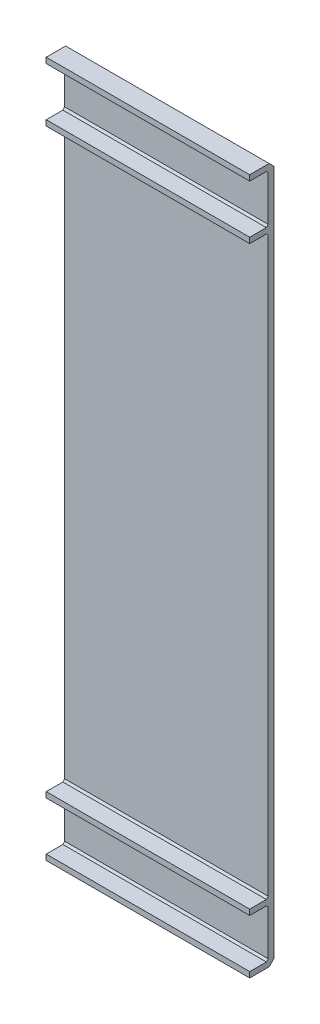
ISO-10303-21;
HEADER;
FILE_DESCRIPTION(('STEP AP214'),'2;1');
FILE_NAME('part.step','',(''),(''),'','','');
FILE_SCHEMA(('AUTOMOTIVE_DESIGN { 1 0 10303 214 1 1 1 1 }'));
ENDSEC;
DATA;
#1=APPLICATION_CONTEXT('core data for automotive mechanical design processes');
#2=APPLICATION_PROTOCOL_DEFINITION('international standard','automotive_design',2000,#1);
#3=PRODUCT_CONTEXT('',#1,'mechanical');
#4=PRODUCT('Part','Part','',(#3));
#5=PRODUCT_RELATED_PRODUCT_CATEGORY('part','',(#4));
#6=PRODUCT_DEFINITION_FORMATION('','',#4);
#7=PRODUCT_DEFINITION_CONTEXT('part definition',#1,'design');
#8=PRODUCT_DEFINITION('design','',#6,#7);
#9=PRODUCT_DEFINITION_SHAPE('','',#8);
#10=(LENGTH_UNIT() NAMED_UNIT(*) SI_UNIT(.MILLI.,.METRE.));
#11=(NAMED_UNIT(*) PLANE_ANGLE_UNIT() SI_UNIT($,.RADIAN.));
#12=(NAMED_UNIT(*) SI_UNIT($,.STERADIAN.) SOLID_ANGLE_UNIT());
#13=UNCERTAINTY_MEASURE_WITH_UNIT(LENGTH_MEASURE(1.E-05),#10,'distance_accuracy_value','');
#14=(GEOMETRIC_REPRESENTATION_CONTEXT(3) GLOBAL_UNCERTAINTY_ASSIGNED_CONTEXT((#13)) GLOBAL_UNIT_ASSIGNED_CONTEXT((#10,
#11,#12)) REPRESENTATION_CONTEXT('',''));
#15=CARTESIAN_POINT('',(0.,0.,0.));
#16=DIRECTION('',(0.,0.,1.));
#17=DIRECTION('',(1.,0.,0.));
#18=AXIS2_PLACEMENT_3D('',#15,#16,#17);
#19=CARTESIAN_POINT('',(0.,0.,1.2));
#20=DIRECTION('',(0.,0.,1.));
#21=DIRECTION('',(1.,0.,0.));
#22=AXIS2_PLACEMENT_3D('',#19,#20,#21);
#23=PLANE('',#22);
#24=DIRECTION('',(0.,1.,0.));
#25=VECTOR('',#24,1.);
#26=CARTESIAN_POINT('',(22.,-75.2,1.2));
#27=LINE('',#26,#25);
#28=CARTESIAN_POINT('',(22.,-61.9,1.2));
#29=VERTEX_POINT('',#28);
#30=CARTESIAN_POINT('',(22.,61.9,1.2));
#31=VERTEX_POINT('',#30);
#32=EDGE_CURVE('E341',#29,#31,#27,.T.);
#33=ORIENTED_EDGE('',*,*,#32,.T.);
#34=DIRECTION('',(-1.,0.,0.));
#35=VECTOR('',#34,1.);
#36=CARTESIAN_POINT('',(0.,61.9,1.2));
#37=LINE('',#36,#35);
#38=CARTESIAN_POINT('',(-22.,61.9,1.2));
#39=VERTEX_POINT('',#38);
#40=EDGE_CURVE('E376',#31,#39,#37,.T.);
#41=ORIENTED_EDGE('',*,*,#40,.T.);
#42=DIRECTION('',(0.,-1.,0.));
#43=VECTOR('',#42,1.);
#44=CARTESIAN_POINT('',(-22.,-75.2,1.2));
#45=LINE('',#44,#43);
#46=CARTESIAN_POINT('',(-22.,-61.9,1.2));
#47=VERTEX_POINT('',#46);
#48=EDGE_CURVE('E335',#39,#47,#45,.T.);
#49=ORIENTED_EDGE('',*,*,#48,.T.);
#50=DIRECTION('',(1.,0.,0.));
#51=VECTOR('',#50,1.);
#52=CARTESIAN_POINT('',(0.,-61.9,1.2));
#53=LINE('',#52,#51);
#54=EDGE_CURVE('E373',#47,#29,#53,.T.);
#55=ORIENTED_EDGE('',*,*,#54,.T.);
#56=EDGE_LOOP('',(#33,#41,#49,#55));
#57=FACE_BOUND('',#56,.T.);
#58=ADVANCED_FACE('F46',(#57),#23,.T.);
#59=CARTESIAN_POINT('',(22.,63.9,1.2));
#60=VERTEX_POINT('',#59);
#61=CARTESIAN_POINT('',(22.,73.6000000000001,1.2));
#62=VERTEX_POINT('',#61);
#63=EDGE_CURVE('E342',#60,#62,#27,.T.);
#64=ORIENTED_EDGE('',*,*,#63,.T.);
#65=DIRECTION('',(-1.,0.,0.));
#66=VECTOR('',#65,1.);
#67=CARTESIAN_POINT('',(0.,73.6,1.2));
#68=LINE('',#67,#66);
#69=CARTESIAN_POINT('',(-22.,73.6000000000001,1.2));
#70=VERTEX_POINT('',#69);
#71=EDGE_CURVE('E366',#62,#70,#68,.T.);
#72=ORIENTED_EDGE('',*,*,#71,.T.);
#73=CARTESIAN_POINT('',(-22.,63.9,1.2));
#74=VERTEX_POINT('',#73);
#75=EDGE_CURVE('E336',#70,#74,#45,.T.);
#76=ORIENTED_EDGE('',*,*,#75,.T.);
#77=DIRECTION('',(1.,0.,0.));
#78=VECTOR('',#77,1.);
#79=CARTESIAN_POINT('',(0.,63.9,1.2));
#80=LINE('',#79,#78);
#81=EDGE_CURVE('E363',#74,#60,#80,.T.);
#82=ORIENTED_EDGE('',*,*,#81,.T.);
#83=EDGE_LOOP('',(#64,#72,#76,#82));
#84=FACE_BOUND('',#83,.T.);
#85=ADVANCED_FACE('F544',(#84),#23,.T.);
#86=CARTESIAN_POINT('',(-22.,75.2,1.2));
#87=DIRECTION('',(0.,-1.,0.));
#88=DIRECTION('',(0.,0.,-1.));
#89=AXIS2_PLACEMENT_3D('',#86,#87,#88);
#90=PLANE('',#89);
#91=DIRECTION('',(0.,0.,-1.));
#92=VECTOR('',#91,1.);
#93=CARTESIAN_POINT('',(22.,75.2,1.2));
#94=LINE('',#93,#92);
#95=CARTESIAN_POINT('',(22.,75.2,5.2));
#96=VERTEX_POINT('',#95);
#97=CARTESIAN_POINT('',(22.,75.2,0.999999999999987));
#98=VERTEX_POINT('',#97);
#99=EDGE_CURVE('E340',#96,#98,#94,.T.);
#100=ORIENTED_EDGE('',*,*,#99,.T.);
#101=DIRECTION('',(-1.,0.,0.));
#102=VECTOR('',#101,1.);
#103=CARTESIAN_POINT('',(-22.,75.2,0.999999999999987));
#104=LINE('',#103,#102);
#105=CARTESIAN_POINT('',(-22.,75.2,0.999999999999987));
#106=VERTEX_POINT('',#105);
#107=EDGE_CURVE('E436',#98,#106,#104,.T.);
#108=ORIENTED_EDGE('',*,*,#107,.T.);
#109=DIRECTION('',(0.,0.,-1.));
#110=VECTOR('',#109,1.);
#111=CARTESIAN_POINT('',(-22.,75.2,1.2));
#112=LINE('',#111,#110);
#113=CARTESIAN_POINT('',(-22.,75.2,5.2));
#114=VERTEX_POINT('',#113);
#115=EDGE_CURVE('E357',#114,#106,#112,.T.);
#116=ORIENTED_EDGE('',*,*,#115,.F.);
#117=DIRECTION('',(-1.,0.,0.));
#118=VECTOR('',#117,1.);
#119=CARTESIAN_POINT('',(-22.,75.2,5.2));
#120=LINE('',#119,#118);
#121=EDGE_CURVE('E231',#96,#114,#120,.T.);
#122=ORIENTED_EDGE('',*,*,#121,.F.);
#123=EDGE_LOOP('',(#100,#108,#116,#122));
#124=FACE_BOUND('',#123,.T.);
#125=ADVANCED_FACE('F459',(#124),#90,.F.);
#126=CARTESIAN_POINT('',(-22.,-75.2,1.2));
#127=DIRECTION('',(1.,0.,0.));
#128=DIRECTION('',(0.,0.,-1.));
#129=AXIS2_PLACEMENT_3D('',#126,#127,#128);
#130=PLANE('',#129);
#131=ORIENTED_EDGE('',*,*,#115,.T.);
#132=DIRECTION('',(0.,0.707106781186552,0.707106781186543));
#133=VECTOR('',#132,1.);
#134=CARTESIAN_POINT('',(-22.,75.2,0.999999999999987));
#135=LINE('',#134,#133);
#136=CARTESIAN_POINT('',(-22.,74.2,0.));
#137=VERTEX_POINT('',#136);
#138=EDGE_CURVE('E443',#106,#137,#135,.F.);
#139=ORIENTED_EDGE('',*,*,#138,.T.);
#140=DIRECTION('',(0.,-1.,0.));
#141=VECTOR('',#140,1.);
#142=CARTESIAN_POINT('',(-22.,-75.2,0.));
#143=LINE('',#142,#141);
#144=CARTESIAN_POINT('',(-22.,-74.2,0.));
#145=VERTEX_POINT('',#144);
#146=EDGE_CURVE('E242',#137,#145,#143,.T.);
#147=ORIENTED_EDGE('',*,*,#146,.T.);
#148=DIRECTION('',(0.,0.707106781186552,-0.707106781186543));
#149=VECTOR('',#148,1.);
#150=CARTESIAN_POINT('',(-22.,-75.2,0.999999999999987));
#151=LINE('',#150,#149);
#152=CARTESIAN_POINT('',(-22.,-75.2,0.999999999999987));
#153=VERTEX_POINT('',#152);
#154=EDGE_CURVE('E440',#145,#153,#151,.F.);
#155=ORIENTED_EDGE('',*,*,#154,.T.);
#156=DIRECTION('',(0.,0.,-1.));
#157=VECTOR('',#156,1.);
#158=CARTESIAN_POINT('',(-22.,-75.2,1.2));
#159=LINE('',#158,#157);
#160=CARTESIAN_POINT('',(-22.,-75.2,5.2));
#161=VERTEX_POINT('',#160);
#162=EDGE_CURVE('E353',#161,#153,#159,.T.);
#163=ORIENTED_EDGE('',*,*,#162,.F.);
#164=DIRECTION('',(0.,-1.,0.));
#165=VECTOR('',#164,1.);
#166=CARTESIAN_POINT('',(-22.,-75.2,5.2));
#167=LINE('',#166,#165);
#168=CARTESIAN_POINT('',(-22.,-74.,5.2));
#169=VERTEX_POINT('',#168);
#170=EDGE_CURVE('E235',#169,#161,#167,.T.);
#171=ORIENTED_EDGE('',*,*,#170,.F.);
#172=DIRECTION('',(0.,0.,-1.));
#173=VECTOR('',#172,1.);
#174=CARTESIAN_POINT('',(-22.,-74.,5.2));
#175=LINE('',#174,#173);
#176=CARTESIAN_POINT('',(-22.,-74.,1.59999999999997));
#177=VERTEX_POINT('',#176);
#178=EDGE_CURVE('E256',#169,#177,#175,.T.);
#179=ORIENTED_EDGE('',*,*,#178,.T.);
#180=DIRECTION('',(0.,0.707106781186548,-0.707106781186547));
#181=VECTOR('',#180,1.);
#182=CARTESIAN_POINT('',(-22.,-74.4,1.99999999999999));
#183=LINE('',#182,#181);
#184=CARTESIAN_POINT('',(-22.,-73.6,1.2));
#185=VERTEX_POINT('',#184);
#186=EDGE_CURVE('E424',#177,#185,#183,.T.);
#187=ORIENTED_EDGE('',*,*,#186,.T.);
#188=CARTESIAN_POINT('',(-22.,-63.9,1.2));
#189=VERTEX_POINT('',#188);
#190=EDGE_CURVE('E331',#189,#185,#45,.T.);
#191=ORIENTED_EDGE('',*,*,#190,.F.);
#192=DIRECTION('',(0.,0.707106781186548,0.707106781186547));
#193=VECTOR('',#192,1.);
#194=CARTESIAN_POINT('',(-22.,-69.55,-4.45000000000002));
#195=LINE('',#194,#193);
#196=CARTESIAN_POINT('',(-22.,-63.5,1.59999999999997));
#197=VERTEX_POINT('',#196);
#198=EDGE_CURVE('E433',#189,#197,#195,.T.);
#199=ORIENTED_EDGE('',*,*,#198,.T.);
#200=DIRECTION('',(0.,0.,-1.));
#201=VECTOR('',#200,1.);
#202=CARTESIAN_POINT('',(-22.,-63.5,5.2));
#203=LINE('',#202,#201);
#204=CARTESIAN_POINT('',(-22.,-63.5,5.2));
#205=VERTEX_POINT('',#204);
#206=EDGE_CURVE('E274',#205,#197,#203,.T.);
#207=ORIENTED_EDGE('',*,*,#206,.F.);
#208=DIRECTION('',(0.,-1.,0.));
#209=VECTOR('',#208,1.);
#210=CARTESIAN_POINT('',(-22.,-62.3,5.2));
#211=LINE('',#210,#209);
#212=CARTESIAN_POINT('',(-22.,-62.3,5.2));
#213=VERTEX_POINT('',#212);
#214=EDGE_CURVE('E257',#213,#205,#211,.T.);
#215=ORIENTED_EDGE('',*,*,#214,.F.);
#216=DIRECTION('',(0.,0.,-1.));
#217=VECTOR('',#216,1.);
#218=CARTESIAN_POINT('',(-22.,-62.3,5.2));
#219=LINE('',#218,#217);
#220=CARTESIAN_POINT('',(-22.,-62.3,1.6));
#221=VERTEX_POINT('',#220);
#222=EDGE_CURVE('E287',#213,#221,#219,.T.);
#223=ORIENTED_EDGE('',*,*,#222,.T.);
#224=DIRECTION('',(0.,0.707106781186535,-0.70710678118656));
#225=VECTOR('',#224,1.);
#226=CARTESIAN_POINT('',(-22.,-68.5499999999998,7.84999999999999));
#227=LINE('',#226,#225);
#228=EDGE_CURVE('E418',#221,#47,#227,.T.);
#229=ORIENTED_EDGE('',*,*,#228,.T.);
#230=ORIENTED_EDGE('',*,*,#48,.F.);
#231=DIRECTION('',(0.,0.707106781186548,0.707106781186547));
#232=VECTOR('',#231,1.);
#233=CARTESIAN_POINT('',(-22.,-6.65,-67.35));
#234=LINE('',#233,#232);
#235=CARTESIAN_POINT('',(-22.,62.3,1.59999999999997));
#236=VERTEX_POINT('',#235);
#237=EDGE_CURVE('E409',#39,#236,#234,.T.);
#238=ORIENTED_EDGE('',*,*,#237,.T.);
#239=DIRECTION('',(0.,0.,-1.));
#240=VECTOR('',#239,1.);
#241=CARTESIAN_POINT('',(-22.,62.3,5.2));
#242=LINE('',#241,#240);
#243=CARTESIAN_POINT('',(-22.,62.3,5.2));
#244=VERTEX_POINT('',#243);
#245=EDGE_CURVE('E303',#244,#236,#242,.T.);
#246=ORIENTED_EDGE('',*,*,#245,.F.);
#247=DIRECTION('',(0.,-1.,0.));
#248=VECTOR('',#247,1.);
#249=CARTESIAN_POINT('',(-22.,63.5,5.2));
#250=LINE('',#249,#248);
#251=CARTESIAN_POINT('',(-22.,63.5,5.2));
#252=VERTEX_POINT('',#251);
#253=EDGE_CURVE('E279',#252,#244,#250,.T.);
#254=ORIENTED_EDGE('',*,*,#253,.F.);
#255=DIRECTION('',(0.,0.,-1.));
#256=VECTOR('',#255,1.);
#257=CARTESIAN_POINT('',(-22.,63.5,5.2));
#258=LINE('',#257,#256);
#259=CARTESIAN_POINT('',(-22.,63.5,1.59999999999997));
#260=VERTEX_POINT('',#259);
#261=EDGE_CURVE('E315',#252,#260,#258,.T.);
#262=ORIENTED_EDGE('',*,*,#261,.T.);
#263=DIRECTION('',(0.,0.707106781186548,-0.707106781186547));
#264=VECTOR('',#263,1.);
#265=CARTESIAN_POINT('',(-22.,-5.65000000000004,70.75));
#266=LINE('',#265,#264);
#267=EDGE_CURVE('E412',#260,#74,#266,.T.);
#268=ORIENTED_EDGE('',*,*,#267,.T.);
#269=ORIENTED_EDGE('',*,*,#75,.F.);
#270=DIRECTION('',(0.,0.707106781186548,0.707106781186547));
#271=VECTOR('',#270,1.);
#272=CARTESIAN_POINT('',(-22.,-0.800000000000009,-73.2));
#273=LINE('',#272,#271);
#274=CARTESIAN_POINT('',(-22.,74.,1.59999999999997));
#275=VERTEX_POINT('',#274);
#276=EDGE_CURVE('E240',#70,#275,#273,.T.);
#277=ORIENTED_EDGE('',*,*,#276,.T.);
#278=DIRECTION('',(0.,0.,-1.));
#279=VECTOR('',#278,1.);
#280=CARTESIAN_POINT('',(-22.,74.,5.2));
#281=LINE('',#280,#279);
#282=CARTESIAN_POINT('',(-22.,74.,5.2));
#283=VERTEX_POINT('',#282);
#284=EDGE_CURVE('E216',#283,#275,#281,.T.);
#285=ORIENTED_EDGE('',*,*,#284,.F.);
#286=DIRECTION('',(0.,-1.,0.));
#287=VECTOR('',#286,1.);
#288=CARTESIAN_POINT('',(-22.,75.2,5.2));
#289=LINE('',#288,#287);
#290=EDGE_CURVE('E225',#114,#283,#289,.T.);
#291=ORIENTED_EDGE('',*,*,#290,.F.);
#292=EDGE_LOOP('',(#131,#139,#147,#155,#163,#171,#179,#187,#191,#199,#207,#215,#223,#229,#230,
#238,#246,#254,#262,#268,#269,#277,#285,#291));
#293=FACE_BOUND('',#292,.T.);
#294=ADVANCED_FACE('F237',(#293),#130,.F.);
#295=CARTESIAN_POINT('',(-22.,-75.2,1.2));
#296=DIRECTION('',(0.,1.,0.));
#297=DIRECTION('',(0.,0.,1.));
#298=AXIS2_PLACEMENT_3D('',#295,#296,#297);
#299=PLANE('',#298);
#300=ORIENTED_EDGE('',*,*,#162,.T.);
#301=DIRECTION('',(1.,0.,0.));
#302=VECTOR('',#301,1.);
#303=CARTESIAN_POINT('',(-22.,-75.2,0.999999999999987));
#304=LINE('',#303,#302);
#305=CARTESIAN_POINT('',(22.,-75.2,0.999999999999987));
#306=VERTEX_POINT('',#305);
#307=EDGE_CURVE('E11',#153,#306,#304,.T.);
#308=ORIENTED_EDGE('',*,*,#307,.T.);
#309=DIRECTION('',(0.,0.,-1.));
#310=VECTOR('',#309,1.);
#311=CARTESIAN_POINT('',(22.,-75.2,1.2));
#312=LINE('',#311,#310);
#313=CARTESIAN_POINT('',(22.,-75.2,5.2));
#314=VERTEX_POINT('',#313);
#315=EDGE_CURVE('E349',#314,#306,#312,.T.);
#316=ORIENTED_EDGE('',*,*,#315,.F.);
#317=DIRECTION('',(1.,0.,0.));
#318=VECTOR('',#317,1.);
#319=CARTESIAN_POINT('',(-22.,-75.2,5.2));
#320=LINE('',#319,#318);
#321=EDGE_CURVE('E267',#161,#314,#320,.T.);
#322=ORIENTED_EDGE('',*,*,#321,.F.);
#323=EDGE_LOOP('',(#300,#308,#316,#322));
#324=FACE_BOUND('',#323,.T.);
#325=ADVANCED_FACE('F466',(#324),#299,.F.);
#326=CARTESIAN_POINT('',(22.,-75.2,1.2));
#327=DIRECTION('',(-1.,0.,0.));
#328=DIRECTION('',(0.,0.,1.));
#329=AXIS2_PLACEMENT_3D('',#326,#327,#328);
#330=PLANE('',#329);
#331=DIRECTION('',(0.,1.,0.));
#332=VECTOR('',#331,1.);
#333=CARTESIAN_POINT('',(22.,-75.2,0.));
#334=LINE('',#333,#332);
#335=CARTESIAN_POINT('',(22.,-74.2,0.));
#336=VERTEX_POINT('',#335);
#337=CARTESIAN_POINT('',(22.,74.2,0.));
#338=VERTEX_POINT('',#337);
#339=EDGE_CURVE('E247',#336,#338,#334,.T.);
#340=ORIENTED_EDGE('',*,*,#339,.T.);
#341=DIRECTION('',(0.,-0.707106781186552,-0.707106781186543));
#342=VECTOR('',#341,1.);
#343=CARTESIAN_POINT('',(22.,75.2,0.999999999999987));
#344=LINE('',#343,#342);
#345=EDGE_CURVE('E56',#338,#98,#344,.F.);
#346=ORIENTED_EDGE('',*,*,#345,.T.);
#347=ORIENTED_EDGE('',*,*,#99,.F.);
#348=DIRECTION('',(0.,1.,0.));
#349=VECTOR('',#348,1.);
#350=CARTESIAN_POINT('',(22.,75.2,5.2));
#351=LINE('',#350,#349);
#352=CARTESIAN_POINT('',(22.,74.,5.2));
#353=VERTEX_POINT('',#352);
#354=EDGE_CURVE('E224',#353,#96,#351,.T.);
#355=ORIENTED_EDGE('',*,*,#354,.F.);
#356=DIRECTION('',(0.,0.,-1.));
#357=VECTOR('',#356,1.);
#358=CARTESIAN_POINT('',(22.,74.,5.2));
#359=LINE('',#358,#357);
#360=CARTESIAN_POINT('',(22.,74.,1.59999999999997));
#361=VERTEX_POINT('',#360);
#362=EDGE_CURVE('E219',#353,#361,#359,.T.);
#363=ORIENTED_EDGE('',*,*,#362,.T.);
#364=DIRECTION('',(0.,-0.707106781186548,-0.707106781186547));
#365=VECTOR('',#364,1.);
#366=CARTESIAN_POINT('',(22.,-0.800000000000009,-73.2));
#367=LINE('',#366,#365);
#368=EDGE_CURVE('E401',#361,#62,#367,.T.);
#369=ORIENTED_EDGE('',*,*,#368,.T.);
#370=ORIENTED_EDGE('',*,*,#63,.F.);
#371=DIRECTION('',(0.,-0.707106781186548,0.707106781186547));
#372=VECTOR('',#371,1.);
#373=CARTESIAN_POINT('',(22.,-5.65000000000004,70.75));
#374=LINE('',#373,#372);
#375=CARTESIAN_POINT('',(22.,63.5,1.59999999999997));
#376=VERTEX_POINT('',#375);
#377=EDGE_CURVE('E415',#60,#376,#374,.T.);
#378=ORIENTED_EDGE('',*,*,#377,.T.);
#379=DIRECTION('',(0.,0.,-1.));
#380=VECTOR('',#379,1.);
#381=CARTESIAN_POINT('',(22.,63.5,5.2));
#382=LINE('',#381,#380);
#383=CARTESIAN_POINT('',(22.,63.5,5.2));
#384=VERTEX_POINT('',#383);
#385=EDGE_CURVE('E311',#384,#376,#382,.T.);
#386=ORIENTED_EDGE('',*,*,#385,.F.);
#387=DIRECTION('',(0.,1.,0.));
#388=VECTOR('',#387,1.);
#389=CARTESIAN_POINT('',(22.,63.5,5.2));
#390=LINE('',#389,#388);
#391=CARTESIAN_POINT('',(22.,62.3,5.2));
#392=VERTEX_POINT('',#391);
#393=EDGE_CURVE('E322',#392,#384,#390,.T.);
#394=ORIENTED_EDGE('',*,*,#393,.F.);
#395=DIRECTION('',(0.,0.,-1.));
#396=VECTOR('',#395,1.);
#397=CARTESIAN_POINT('',(22.,62.3,5.2));
#398=LINE('',#397,#396);
#399=CARTESIAN_POINT('',(22.,62.3,1.59999999999997));
#400=VERTEX_POINT('',#399);
#401=EDGE_CURVE('E307',#392,#400,#398,.T.);
#402=ORIENTED_EDGE('',*,*,#401,.T.);
#403=DIRECTION('',(0.,-0.707106781186548,-0.707106781186547));
#404=VECTOR('',#403,1.);
#405=CARTESIAN_POINT('',(22.,-6.65,-67.35));
#406=LINE('',#405,#404);
#407=EDGE_CURVE('E406',#400,#31,#406,.T.);
#408=ORIENTED_EDGE('',*,*,#407,.T.);
#409=ORIENTED_EDGE('',*,*,#32,.F.);
#410=DIRECTION('',(0.,-0.707106781186535,0.70710678118656));
#411=VECTOR('',#410,1.);
#412=CARTESIAN_POINT('',(22.,-68.5499999999998,7.85));
#413=LINE('',#412,#411);
#414=CARTESIAN_POINT('',(22.,-62.3,1.6));
#415=VERTEX_POINT('',#414);
#416=EDGE_CURVE('E421',#29,#415,#413,.T.);
#417=ORIENTED_EDGE('',*,*,#416,.T.);
#418=DIRECTION('',(0.,0.,-1.));
#419=VECTOR('',#418,1.);
#420=CARTESIAN_POINT('',(22.,-62.3,5.2));
#421=LINE('',#420,#419);
#422=CARTESIAN_POINT('',(22.,-62.3,5.2));
#423=VERTEX_POINT('',#422);
#424=EDGE_CURVE('E283',#423,#415,#421,.T.);
#425=ORIENTED_EDGE('',*,*,#424,.F.);
#426=DIRECTION('',(0.,1.,0.));
#427=VECTOR('',#426,1.);
#428=CARTESIAN_POINT('',(22.,-62.3,5.2));
#429=LINE('',#428,#427);
#430=CARTESIAN_POINT('',(22.,-63.5,5.2));
#431=VERTEX_POINT('',#430);
#432=EDGE_CURVE('E294',#431,#423,#429,.T.);
#433=ORIENTED_EDGE('',*,*,#432,.F.);
#434=DIRECTION('',(0.,0.,-1.));
#435=VECTOR('',#434,1.);
#436=CARTESIAN_POINT('',(22.,-63.5,5.2));
#437=LINE('',#436,#435);
#438=CARTESIAN_POINT('',(22.,-63.5,1.59999999999997));
#439=VERTEX_POINT('',#438);
#440=EDGE_CURVE('E278',#431,#439,#437,.T.);
#441=ORIENTED_EDGE('',*,*,#440,.T.);
#442=DIRECTION('',(0.,-0.707106781186548,-0.707106781186547));
#443=VECTOR('',#442,1.);
#444=CARTESIAN_POINT('',(22.,-69.55,-4.45000000000002));
#445=LINE('',#444,#443);
#446=CARTESIAN_POINT('',(22.,-63.9,1.2));
#447=VERTEX_POINT('',#446);
#448=EDGE_CURVE('E430',#439,#447,#445,.T.);
#449=ORIENTED_EDGE('',*,*,#448,.T.);
#450=CARTESIAN_POINT('',(22.,-73.6,1.2));
#451=VERTEX_POINT('',#450);
#452=EDGE_CURVE('E337',#451,#447,#27,.T.);
#453=ORIENTED_EDGE('',*,*,#452,.F.);
#454=DIRECTION('',(0.,-0.707106781186548,0.707106781186547));
#455=VECTOR('',#454,1.);
#456=CARTESIAN_POINT('',(22.,-74.4,1.99999999999999));
#457=LINE('',#456,#455);
#458=CARTESIAN_POINT('',(22.,-74.,1.59999999999997));
#459=VERTEX_POINT('',#458);
#460=EDGE_CURVE('E427',#451,#459,#457,.T.);
#461=ORIENTED_EDGE('',*,*,#460,.T.);
#462=DIRECTION('',(0.,0.,-1.));
#463=VECTOR('',#462,1.);
#464=CARTESIAN_POINT('',(22.,-74.,5.2));
#465=LINE('',#464,#463);
#466=CARTESIAN_POINT('',(22.,-74.,5.2));
#467=VERTEX_POINT('',#466);
#468=EDGE_CURVE('E252',#467,#459,#465,.T.);
#469=ORIENTED_EDGE('',*,*,#468,.F.);
#470=DIRECTION('',(0.,1.,0.));
#471=VECTOR('',#470,1.);
#472=CARTESIAN_POINT('',(22.,-75.2,5.2));
#473=LINE('',#472,#471);
#474=EDGE_CURVE('E264',#314,#467,#473,.T.);
#475=ORIENTED_EDGE('',*,*,#474,.F.);
#476=ORIENTED_EDGE('',*,*,#315,.T.);
#477=DIRECTION('',(0.,-0.707106781186552,0.707106781186543));
#478=VECTOR('',#477,1.);
#479=CARTESIAN_POINT('',(22.,-75.2,0.999999999999987));
#480=LINE('',#479,#478);
#481=EDGE_CURVE('E63',#306,#336,#480,.F.);
#482=ORIENTED_EDGE('',*,*,#481,.T.);
#483=EDGE_LOOP('',(#340,#346,#347,#355,#363,#369,#370,#378,#386,#394,#402,#408,#409,#417,#425,
#433,#441,#449,#453,#461,#469,#475,#476,#482));
#484=FACE_BOUND('',#483,.T.);
#485=ADVANCED_FACE('F455',(#484),#330,.F.);
#486=ORIENTED_EDGE('',*,*,#190,.T.);
#487=DIRECTION('',(1.,0.,0.));
#488=VECTOR('',#487,1.);
#489=CARTESIAN_POINT('',(0.,-73.6,1.2));
#490=LINE('',#489,#488);
#491=EDGE_CURVE('E394',#185,#451,#490,.T.);
#492=ORIENTED_EDGE('',*,*,#491,.T.);
#493=ORIENTED_EDGE('',*,*,#452,.T.);
#494=DIRECTION('',(-1.,0.,0.));
#495=VECTOR('',#494,1.);
#496=CARTESIAN_POINT('',(0.,-63.9,1.2));
#497=LINE('',#496,#495);
#498=EDGE_CURVE('E391',#447,#189,#497,.T.);
#499=ORIENTED_EDGE('',*,*,#498,.T.);
#500=EDGE_LOOP('',(#486,#492,#493,#499));
#501=FACE_BOUND('',#500,.T.);
#502=ADVANCED_FACE('F483',(#501),#23,.T.);
#503=CARTESIAN_POINT('',(0.,0.,0.));
#504=DIRECTION('',(0.,0.,1.));
#505=DIRECTION('',(1.,0.,0.));
#506=AXIS2_PLACEMENT_3D('',#503,#504,#505);
#507=PLANE('',#506);
#508=ORIENTED_EDGE('',*,*,#146,.F.);
#509=DIRECTION('',(1.,0.,0.));
#510=VECTOR('',#509,1.);
#511=CARTESIAN_POINT('',(0.,74.2,0.));
#512=LINE('',#511,#510);
#513=EDGE_CURVE('E70',#137,#338,#512,.T.);
#514=ORIENTED_EDGE('',*,*,#513,.T.);
#515=ORIENTED_EDGE('',*,*,#339,.F.);
#516=DIRECTION('',(-1.,0.,0.));
#517=VECTOR('',#516,1.);
#518=CARTESIAN_POINT('',(0.,-74.2,0.));
#519=LINE('',#518,#517);
#520=EDGE_CURVE('E446',#336,#145,#519,.T.);
#521=ORIENTED_EDGE('',*,*,#520,.T.);
#522=EDGE_LOOP('',(#508,#514,#515,#521));
#523=FACE_BOUND('',#522,.T.);
#524=ADVANCED_FACE('F462',(#523),#507,.F.);
#525=CARTESIAN_POINT('',(-22.,62.3,5.2));
#526=DIRECTION('',(0.,1.,0.));
#527=DIRECTION('',(0.,0.,1.));
#528=AXIS2_PLACEMENT_3D('',#525,#526,#527);
#529=PLANE('',#528);
#530=ORIENTED_EDGE('',*,*,#245,.T.);
#531=DIRECTION('',(1.,0.,0.));
#532=VECTOR('',#531,1.);
#533=CARTESIAN_POINT('',(-22.,62.3,1.59999999999997));
#534=LINE('',#533,#532);
#535=EDGE_CURVE('E369',#236,#400,#534,.T.);
#536=ORIENTED_EDGE('',*,*,#535,.T.);
#537=ORIENTED_EDGE('',*,*,#401,.F.);
#538=DIRECTION('',(1.,0.,0.));
#539=VECTOR('',#538,1.);
#540=CARTESIAN_POINT('',(-22.,62.3,5.2));
#541=LINE('',#540,#539);
#542=EDGE_CURVE('E325',#244,#392,#541,.T.);
#543=ORIENTED_EDGE('',*,*,#542,.F.);
#544=EDGE_LOOP('',(#530,#536,#537,#543));
#545=FACE_BOUND('',#544,.T.);
#546=ADVANCED_FACE('F530',(#545),#529,.F.);
#547=CARTESIAN_POINT('',(-22.,63.5,5.2));
#548=DIRECTION('',(0.,-1.,0.));
#549=DIRECTION('',(0.,0.,-1.));
#550=AXIS2_PLACEMENT_3D('',#547,#548,#549);
#551=PLANE('',#550);
#552=ORIENTED_EDGE('',*,*,#385,.T.);
#553=DIRECTION('',(-1.,0.,0.));
#554=VECTOR('',#553,1.);
#555=CARTESIAN_POINT('',(-22.,63.5,1.59999999999997));
#556=LINE('',#555,#554);
#557=EDGE_CURVE('E379',#376,#260,#556,.T.);
#558=ORIENTED_EDGE('',*,*,#557,.T.);
#559=ORIENTED_EDGE('',*,*,#261,.F.);
#560=DIRECTION('',(-1.,0.,0.));
#561=VECTOR('',#560,1.);
#562=CARTESIAN_POINT('',(-22.,63.5,5.2));
#563=LINE('',#562,#561);
#564=EDGE_CURVE('E319',#384,#252,#563,.T.);
#565=ORIENTED_EDGE('',*,*,#564,.F.);
#566=EDGE_LOOP('',(#552,#558,#559,#565));
#567=FACE_BOUND('',#566,.T.);
#568=ADVANCED_FACE('F538',(#567),#551,.F.);
#569=CARTESIAN_POINT('',(0.,0.,5.2));
#570=DIRECTION('',(0.,0.,1.));
#571=DIRECTION('',(1.,0.,0.));
#572=AXIS2_PLACEMENT_3D('',#569,#570,#571);
#573=PLANE('',#572);
#574=ORIENTED_EDGE('',*,*,#253,.T.);
#575=ORIENTED_EDGE('',*,*,#542,.T.);
#576=ORIENTED_EDGE('',*,*,#393,.T.);
#577=ORIENTED_EDGE('',*,*,#564,.T.);
#578=EDGE_LOOP('',(#574,#575,#576,#577));
#579=FACE_BOUND('',#578,.T.);
#580=ADVANCED_FACE('F534',(#579),#573,.T.);
#581=CARTESIAN_POINT('',(-22.,-63.5,5.2));
#582=DIRECTION('',(0.,1.,0.));
#583=DIRECTION('',(0.,0.,1.));
#584=AXIS2_PLACEMENT_3D('',#581,#582,#583);
#585=PLANE('',#584);
#586=ORIENTED_EDGE('',*,*,#206,.T.);
#587=DIRECTION('',(1.,0.,0.));
#588=VECTOR('',#587,1.);
#589=CARTESIAN_POINT('',(-22.,-63.5,1.59999999999997));
#590=LINE('',#589,#588);
#591=EDGE_CURVE('E397',#197,#439,#590,.T.);
#592=ORIENTED_EDGE('',*,*,#591,.T.);
#593=ORIENTED_EDGE('',*,*,#440,.F.);
#594=DIRECTION('',(1.,0.,0.));
#595=VECTOR('',#594,1.);
#596=CARTESIAN_POINT('',(-22.,-63.5,5.2));
#597=LINE('',#596,#595);
#598=EDGE_CURVE('E297',#205,#431,#597,.T.);
#599=ORIENTED_EDGE('',*,*,#598,.F.);
#600=EDGE_LOOP('',(#586,#592,#593,#599));
#601=FACE_BOUND('',#600,.T.);
#602=ADVANCED_FACE('F492',(#601),#585,.F.);
#603=CARTESIAN_POINT('',(-22.,-62.3,5.2));
#604=DIRECTION('',(0.,-1.,0.));
#605=DIRECTION('',(1.,0.,0.));
#606=AXIS2_PLACEMENT_3D('',#603,#604,#605);
#607=PLANE('',#606);
#608=ORIENTED_EDGE('',*,*,#424,.T.);
#609=DIRECTION('',(-1.,0.,0.));
#610=VECTOR('',#609,1.);
#611=CARTESIAN_POINT('',(-22.,-62.3,1.6));
#612=LINE('',#611,#610);
#613=EDGE_CURVE('E383',#415,#221,#612,.T.);
#614=ORIENTED_EDGE('',*,*,#613,.T.);
#615=ORIENTED_EDGE('',*,*,#222,.F.);
#616=DIRECTION('',(-1.,0.,0.));
#617=VECTOR('',#616,1.);
#618=CARTESIAN_POINT('',(-22.,-62.3,5.2));
#619=LINE('',#618,#617);
#620=EDGE_CURVE('E291',#423,#213,#619,.T.);
#621=ORIENTED_EDGE('',*,*,#620,.F.);
#622=EDGE_LOOP('',(#608,#614,#615,#621));
#623=FACE_BOUND('',#622,.T.);
#624=ADVANCED_FACE('F501',(#623),#607,.F.);
#625=CARTESIAN_POINT('',(0.,0.,5.2));
#626=DIRECTION('',(0.,0.,1.));
#627=DIRECTION('',(1.,0.,0.));
#628=AXIS2_PLACEMENT_3D('',#625,#626,#627);
#629=PLANE('',#628);
#630=ORIENTED_EDGE('',*,*,#214,.T.);
#631=ORIENTED_EDGE('',*,*,#598,.T.);
#632=ORIENTED_EDGE('',*,*,#432,.T.);
#633=ORIENTED_EDGE('',*,*,#620,.T.);
#634=EDGE_LOOP('',(#630,#631,#632,#633));
#635=FACE_BOUND('',#634,.T.);
#636=ADVANCED_FACE('F497',(#635),#629,.T.);
#637=CARTESIAN_POINT('',(-22.,-74.,5.2));
#638=DIRECTION('',(0.,-1.,0.));
#639=DIRECTION('',(0.,0.,-1.));
#640=AXIS2_PLACEMENT_3D('',#637,#638,#639);
#641=PLANE('',#640);
#642=ORIENTED_EDGE('',*,*,#468,.T.);
#643=DIRECTION('',(-1.,0.,0.));
#644=VECTOR('',#643,1.);
#645=CARTESIAN_POINT('',(-22.,-74.,1.59999999999997));
#646=LINE('',#645,#644);
#647=EDGE_CURVE('E387',#459,#177,#646,.T.);
#648=ORIENTED_EDGE('',*,*,#647,.T.);
#649=ORIENTED_EDGE('',*,*,#178,.F.);
#650=DIRECTION('',(-1.,0.,0.));
#651=VECTOR('',#650,1.);
#652=CARTESIAN_POINT('',(-22.,-74.,5.2));
#653=LINE('',#652,#651);
#654=EDGE_CURVE('E261',#467,#169,#653,.T.);
#655=ORIENTED_EDGE('',*,*,#654,.F.);
#656=EDGE_LOOP('',(#642,#648,#649,#655));
#657=FACE_BOUND('',#656,.T.);
#658=ADVANCED_FACE('F474',(#657),#641,.F.);
#659=CARTESIAN_POINT('',(0.,0.,5.2));
#660=DIRECTION('',(0.,0.,-1.));
#661=DIRECTION('',(-1.,0.,0.));
#662=AXIS2_PLACEMENT_3D('',#659,#660,#661);
#663=PLANE('',#662);
#664=ORIENTED_EDGE('',*,*,#170,.T.);
#665=ORIENTED_EDGE('',*,*,#321,.T.);
#666=ORIENTED_EDGE('',*,*,#474,.T.);
#667=ORIENTED_EDGE('',*,*,#654,.T.);
#668=EDGE_LOOP('',(#664,#665,#666,#667));
#669=FACE_BOUND('',#668,.T.);
#670=ADVANCED_FACE('F469',(#669),#663,.F.);
#671=CARTESIAN_POINT('',(-22.,74.,5.2));
#672=DIRECTION('',(0.,1.,0.));
#673=DIRECTION('',(0.,0.,1.));
#674=AXIS2_PLACEMENT_3D('',#671,#672,#673);
#675=PLANE('',#674);
#676=ORIENTED_EDGE('',*,*,#284,.T.);
#677=DIRECTION('',(1.,0.,0.));
#678=VECTOR('',#677,1.);
#679=CARTESIAN_POINT('',(-22.,74.,1.59999999999997));
#680=LINE('',#679,#678);
#681=EDGE_CURVE('E360',#275,#361,#680,.T.);
#682=ORIENTED_EDGE('',*,*,#681,.T.);
#683=ORIENTED_EDGE('',*,*,#362,.F.);
#684=DIRECTION('',(1.,0.,0.));
#685=VECTOR('',#684,1.);
#686=CARTESIAN_POINT('',(-22.,74.,5.2));
#687=LINE('',#686,#685);
#688=EDGE_CURVE('E211',#283,#353,#687,.T.);
#689=ORIENTED_EDGE('',*,*,#688,.F.);
#690=EDGE_LOOP('',(#676,#682,#683,#689));
#691=FACE_BOUND('',#690,.T.);
#692=ADVANCED_FACE('F213',(#691),#675,.F.);
#693=CARTESIAN_POINT('',(0.,0.,5.2));
#694=DIRECTION('',(0.,0.,1.));
#695=DIRECTION('',(1.,0.,0.));
#696=AXIS2_PLACEMENT_3D('',#693,#694,#695);
#697=PLANE('',#696);
#698=ORIENTED_EDGE('',*,*,#290,.T.);
#699=ORIENTED_EDGE('',*,*,#688,.T.);
#700=ORIENTED_EDGE('',*,*,#354,.T.);
#701=ORIENTED_EDGE('',*,*,#121,.T.);
#702=EDGE_LOOP('',(#698,#699,#700,#701));
#703=FACE_BOUND('',#702,.T.);
#704=ADVANCED_FACE('F229',(#703),#697,.T.);
#705=CARTESIAN_POINT('',(-22.,74.,1.59999999999997));
#706=DIRECTION('',(0.,0.707106781186547,-0.707106781186548));
#707=DIRECTION('',(1.,0.,0.));
#708=AXIS2_PLACEMENT_3D('',#705,#706,#707);
#709=PLANE('',#708);
#710=ORIENTED_EDGE('',*,*,#276,.F.);
#711=ORIENTED_EDGE('',*,*,#71,.F.);
#712=ORIENTED_EDGE('',*,*,#368,.F.);
#713=ORIENTED_EDGE('',*,*,#681,.F.);
#714=EDGE_LOOP('',(#710,#711,#712,#713));
#715=FACE_BOUND('',#714,.T.);
#716=ADVANCED_FACE('F546',(#715),#709,.F.);
#717=CARTESIAN_POINT('',(-22.,62.3,1.59999999999997));
#718=DIRECTION('',(0.,0.707106781186547,-0.707106781186548));
#719=DIRECTION('',(1.,0.,0.));
#720=AXIS2_PLACEMENT_3D('',#717,#718,#719);
#721=PLANE('',#720);
#722=ORIENTED_EDGE('',*,*,#237,.F.);
#723=ORIENTED_EDGE('',*,*,#40,.F.);
#724=ORIENTED_EDGE('',*,*,#407,.F.);
#725=ORIENTED_EDGE('',*,*,#535,.F.);
#726=EDGE_LOOP('',(#722,#723,#724,#725));
#727=FACE_BOUND('',#726,.T.);
#728=ADVANCED_FACE('F525',(#727),#721,.F.);
#729=CARTESIAN_POINT('',(-22.,63.5,1.59999999999997));
#730=DIRECTION('',(0.,-0.707106781186547,-0.707106781186548));
#731=DIRECTION('',(-1.,0.,0.));
#732=AXIS2_PLACEMENT_3D('',#729,#730,#731);
#733=PLANE('',#732);
#734=ORIENTED_EDGE('',*,*,#377,.F.);
#735=ORIENTED_EDGE('',*,*,#81,.F.);
#736=ORIENTED_EDGE('',*,*,#267,.F.);
#737=ORIENTED_EDGE('',*,*,#557,.F.);
#738=EDGE_LOOP('',(#734,#735,#736,#737));
#739=FACE_BOUND('',#738,.T.);
#740=ADVANCED_FACE('F543',(#739),#733,.F.);
#741=CARTESIAN_POINT('',(-22.,-62.3,1.6));
#742=DIRECTION('',(0.,-0.707106781186559,-0.707106781186535));
#743=DIRECTION('',(-1.,0.,0.));
#744=AXIS2_PLACEMENT_3D('',#741,#742,#743);
#745=PLANE('',#744);
#746=ORIENTED_EDGE('',*,*,#416,.F.);
#747=ORIENTED_EDGE('',*,*,#54,.F.);
#748=ORIENTED_EDGE('',*,*,#228,.F.);
#749=ORIENTED_EDGE('',*,*,#613,.F.);
#750=EDGE_LOOP('',(#746,#747,#748,#749));
#751=FACE_BOUND('',#750,.T.);
#752=ADVANCED_FACE('F505',(#751),#745,.F.);
#753=CARTESIAN_POINT('',(-22.,-74.,1.59999999999997));
#754=DIRECTION('',(0.,-0.707106781186547,-0.707106781186548));
#755=DIRECTION('',(-1.,0.,0.));
#756=AXIS2_PLACEMENT_3D('',#753,#754,#755);
#757=PLANE('',#756);
#758=ORIENTED_EDGE('',*,*,#460,.F.);
#759=ORIENTED_EDGE('',*,*,#491,.F.);
#760=ORIENTED_EDGE('',*,*,#186,.F.);
#761=ORIENTED_EDGE('',*,*,#647,.F.);
#762=EDGE_LOOP('',(#758,#759,#760,#761));
#763=FACE_BOUND('',#762,.T.);
#764=ADVANCED_FACE('F479',(#763),#757,.F.);
#765=CARTESIAN_POINT('',(-22.,-63.5,1.59999999999997));
#766=DIRECTION('',(0.,0.707106781186547,-0.707106781186548));
#767=DIRECTION('',(1.,0.,0.));
#768=AXIS2_PLACEMENT_3D('',#765,#766,#767);
#769=PLANE('',#768);
#770=ORIENTED_EDGE('',*,*,#198,.F.);
#771=ORIENTED_EDGE('',*,*,#498,.F.);
#772=ORIENTED_EDGE('',*,*,#448,.F.);
#773=ORIENTED_EDGE('',*,*,#591,.F.);
#774=EDGE_LOOP('',(#770,#771,#772,#773));
#775=FACE_BOUND('',#774,.T.);
#776=ADVANCED_FACE('F490',(#775),#769,.F.);
#777=CARTESIAN_POINT('',(-22.,75.2,0.999999999999987));
#778=DIRECTION('',(0.,-0.707106781186543,0.707106781186552));
#779=DIRECTION('',(-1.,0.,0.));
#780=AXIS2_PLACEMENT_3D('',#777,#778,#779);
#781=PLANE('',#780);
#782=ORIENTED_EDGE('',*,*,#345,.F.);
#783=ORIENTED_EDGE('',*,*,#513,.F.);
#784=ORIENTED_EDGE('',*,*,#138,.F.);
#785=ORIENTED_EDGE('',*,*,#107,.F.);
#786=EDGE_LOOP('',(#782,#783,#784,#785));
#787=FACE_BOUND('',#786,.T.);
#788=ADVANCED_FACE('F460',(#787),#781,.F.);
#789=CARTESIAN_POINT('',(-22.,-75.2,0.999999999999987));
#790=DIRECTION('',(0.,0.707106781186543,0.707106781186552));
#791=DIRECTION('',(1.,0.,0.));
#792=AXIS2_PLACEMENT_3D('',#789,#790,#791);
#793=PLANE('',#792);
#794=ORIENTED_EDGE('',*,*,#154,.F.);
#795=ORIENTED_EDGE('',*,*,#520,.F.);
#796=ORIENTED_EDGE('',*,*,#481,.F.);
#797=ORIENTED_EDGE('',*,*,#307,.F.);
#798=EDGE_LOOP('',(#794,#795,#796,#797));
#799=FACE_BOUND('',#798,.T.);
#800=ADVANCED_FACE('F49',(#799),#793,.F.);
#801=CLOSED_SHELL('',(#58,#85,#125,#294,#325,#485,#502,#524,#546,#568,#580,#602,#624,#636,#658,
#670,#692,#704,#716,#728,#740,#752,#764,#776,#788,#800));
#802=MANIFOLD_SOLID_BREP('B2',#801);
#803=ADVANCED_BREP_SHAPE_REPRESENTATION('',(#18,#802),#14);
#804=SHAPE_DEFINITION_REPRESENTATION(#9,#803);
ENDSEC;
END-ISO-10303-21;
